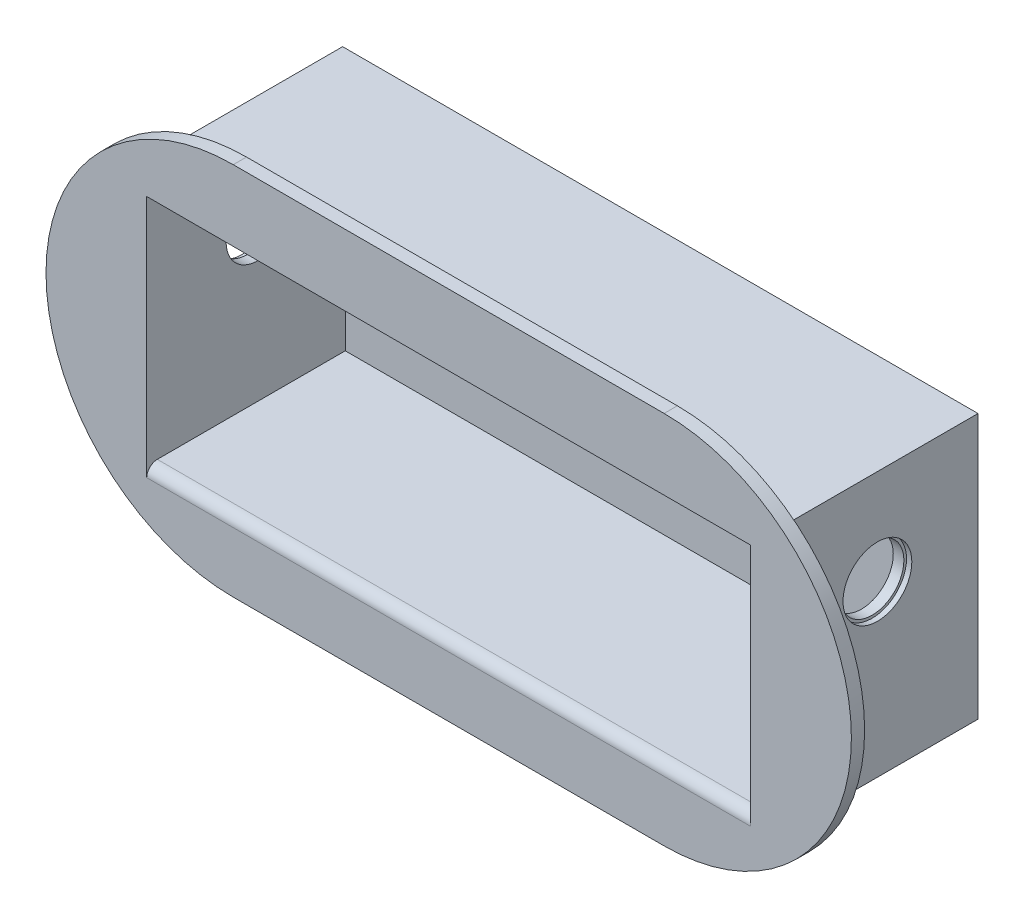
ISO-10303-21;
HEADER;
FILE_DESCRIPTION(('STEP AP214'),'2;1');
FILE_NAME('part.step','',(''),(''),'','','');
FILE_SCHEMA(('AUTOMOTIVE_DESIGN { 1 0 10303 214 1 1 1 1 }'));
ENDSEC;
DATA;
#1=APPLICATION_CONTEXT('core data for automotive mechanical design processes');
#2=APPLICATION_PROTOCOL_DEFINITION('international standard','automotive_design',2000,#1);
#3=PRODUCT_CONTEXT('',#1,'mechanical');
#4=PRODUCT('Part','Part','',(#3));
#5=PRODUCT_RELATED_PRODUCT_CATEGORY('part','',(#4));
#6=PRODUCT_DEFINITION_FORMATION('','',#4);
#7=PRODUCT_DEFINITION_CONTEXT('part definition',#1,'design');
#8=PRODUCT_DEFINITION('design','',#6,#7);
#9=PRODUCT_DEFINITION_SHAPE('','',#8);
#10=(LENGTH_UNIT() NAMED_UNIT(*) SI_UNIT(.MILLI.,.METRE.));
#11=(NAMED_UNIT(*) PLANE_ANGLE_UNIT() SI_UNIT($,.RADIAN.));
#12=(NAMED_UNIT(*) SI_UNIT($,.STERADIAN.) SOLID_ANGLE_UNIT());
#13=UNCERTAINTY_MEASURE_WITH_UNIT(LENGTH_MEASURE(1.E-05),#10,'distance_accuracy_value','');
#14=(GEOMETRIC_REPRESENTATION_CONTEXT(3) GLOBAL_UNCERTAINTY_ASSIGNED_CONTEXT((#13)) GLOBAL_UNIT_ASSIGNED_CONTEXT((#10,
#11,#12)) REPRESENTATION_CONTEXT('',''));
#15=CARTESIAN_POINT('',(0.,0.,0.));
#16=DIRECTION('',(0.,0.,1.));
#17=DIRECTION('',(1.,0.,0.));
#18=AXIS2_PLACEMENT_3D('',#15,#16,#17);
#19=CARTESIAN_POINT('',(193.262166617671,17.7800000000001,48.26));
#20=DIRECTION('',(-1.,0.,0.));
#21=DIRECTION('',(0.,-1.,0.));
#22=AXIS2_PLACEMENT_3D('',#19,#20,#21);
#23=CYLINDRICAL_SURFACE('',#22,15.24);
#24=CARTESIAN_POINT('',(-144.78,17.78,48.26));
#25=DIRECTION('',(1.,0.,0.));
#26=DIRECTION('',(0.,1.,0.));
#27=AXIS2_PLACEMENT_3D('',#24,#25,#26);
#28=CIRCLE('',#27,15.24);
#29=CARTESIAN_POINT('',(-144.78,33.02,48.26));
#30=VERTEX_POINT('',#29);
#31=EDGE_CURVE('E168',#30,#30,#28,.T.);
#32=ORIENTED_EDGE('',*,*,#31,.T.);
#33=EDGE_LOOP('',(#32));
#34=FACE_BOUND('',#33,.T.);
#35=CARTESIAN_POINT('',(-149.86,17.78,48.26));
#36=DIRECTION('',(-1.,0.,0.));
#37=DIRECTION('',(0.,0.,1.));
#38=AXIS2_PLACEMENT_3D('',#35,#36,#37);
#39=CIRCLE('',#38,15.24);
#40=CARTESIAN_POINT('',(-149.86,17.78,63.5));
#41=VERTEX_POINT('',#40);
#42=EDGE_CURVE('E43',#41,#41,#39,.F.);
#43=ORIENTED_EDGE('',*,*,#42,.F.);
#44=EDGE_LOOP('',(#43));
#45=FACE_BOUND('',#44,.T.);
#46=ADVANCED_FACE('F39',(#34,#45),#23,.F.);
#47=CARTESIAN_POINT('',(144.78,17.78,48.26));
#48=DIRECTION('',(-1.,0.,0.));
#49=DIRECTION('',(0.,-1.,0.));
#50=AXIS2_PLACEMENT_3D('',#47,#48,#49);
#51=CIRCLE('',#50,15.24);
#52=CARTESIAN_POINT('',(144.78,2.54000000000005,48.26));
#53=VERTEX_POINT('',#52);
#54=EDGE_CURVE('E247',#53,#53,#51,.T.);
#55=ORIENTED_EDGE('',*,*,#54,.T.);
#56=EDGE_LOOP('',(#55));
#57=FACE_BOUND('',#56,.T.);
#58=CARTESIAN_POINT('',(149.86,17.78,48.26));
#59=DIRECTION('',(1.,0.,0.));
#60=DIRECTION('',(0.,0.,-1.));
#61=AXIS2_PLACEMENT_3D('',#58,#59,#60);
#62=CIRCLE('',#61,15.24);
#63=CARTESIAN_POINT('',(149.86,17.78,33.02));
#64=VERTEX_POINT('',#63);
#65=EDGE_CURVE('E245',#64,#64,#62,.F.);
#66=ORIENTED_EDGE('',*,*,#65,.F.);
#67=EDGE_LOOP('',(#66));
#68=FACE_BOUND('',#67,.T.);
#69=ADVANCED_FACE('F273',(#57,#68),#23,.F.);
#70=CARTESIAN_POINT('',(0.,0.,101.6));
#71=DIRECTION('',(0.,0.,1.));
#72=DIRECTION('',(1.,0.,0.));
#73=AXIS2_PLACEMENT_3D('',#70,#71,#72);
#74=PLANE('',#73);
#75=DIRECTION('',(0.,1.,0.));
#76=VECTOR('',#75,1.);
#77=CARTESIAN_POINT('',(144.78,-55.88,101.6));
#78=LINE('',#77,#76);
#79=CARTESIAN_POINT('',(144.78,-60.96,101.6));
#80=VERTEX_POINT('',#79);
#81=CARTESIAN_POINT('',(144.78,55.88,101.6));
#82=VERTEX_POINT('',#81);
#83=EDGE_CURVE('E56',#80,#82,#78,.T.);
#84=ORIENTED_EDGE('',*,*,#83,.F.);
#85=DIRECTION('',(1.,0.,0.));
#86=VECTOR('',#85,1.);
#87=CARTESIAN_POINT('',(0.,-60.96,101.6));
#88=LINE('',#87,#86);
#89=CARTESIAN_POINT('',(-144.78,-60.96,101.6));
#90=VERTEX_POINT('',#89);
#91=EDGE_CURVE('E237',#80,#90,#88,.F.);
#92=ORIENTED_EDGE('',*,*,#91,.T.);
#93=DIRECTION('',(0.,-1.,0.));
#94=VECTOR('',#93,1.);
#95=CARTESIAN_POINT('',(-144.78,55.88,101.6));
#96=LINE('',#95,#94);
#97=CARTESIAN_POINT('',(-144.78,55.88,101.6));
#98=VERTEX_POINT('',#97);
#99=EDGE_CURVE('E63',#98,#90,#96,.T.);
#100=ORIENTED_EDGE('',*,*,#99,.F.);
#101=DIRECTION('',(-1.,0.,0.));
#102=VECTOR('',#101,1.);
#103=CARTESIAN_POINT('',(144.78,55.88,101.6));
#104=LINE('',#103,#102);
#105=EDGE_CURVE('E514',#82,#98,#104,.T.);
#106=ORIENTED_EDGE('',*,*,#105,.F.);
#107=EDGE_LOOP('',(#84,#92,#100,#106));
#108=FACE_BOUND('',#107,.T.);
#109=CARTESIAN_POINT('',(-103.259510136844,0.,101.6));
#110=DIRECTION('',(0.,0.,1.));
#111=DIRECTION('',(1.,0.,0.));
#112=AXIS2_PLACEMENT_3D('',#109,#110,#111);
#113=CIRCLE('',#112,89.8371201713388);
#114=CARTESIAN_POINT('',(-103.259510136844,89.8371201713388,101.6));
#115=VERTEX_POINT('',#114);
#116=CARTESIAN_POINT('',(-103.259510136844,-89.8371201713388,101.6));
#117=VERTEX_POINT('',#116);
#118=EDGE_CURVE('E173',#115,#117,#113,.T.);
#119=ORIENTED_EDGE('',*,*,#118,.T.);
#120=DIRECTION('',(1.,0.,0.));
#121=VECTOR('',#120,1.);
#122=CARTESIAN_POINT('',(-103.259510136844,-89.8371201713388,101.6));
#123=LINE('',#122,#121);
#124=CARTESIAN_POINT('',(103.425046446333,-89.8371201713388,101.6));
#125=VERTEX_POINT('',#124);
#126=EDGE_CURVE('E141',#117,#125,#123,.T.);
#127=ORIENTED_EDGE('',*,*,#126,.T.);
#128=CARTESIAN_POINT('',(103.425046446333,0.,101.6));
#129=DIRECTION('',(0.,0.,1.));
#130=DIRECTION('',(1.,0.,0.));
#131=AXIS2_PLACEMENT_3D('',#128,#129,#130);
#132=CIRCLE('',#131,89.8371201713388);
#133=CARTESIAN_POINT('',(103.425046446333,89.8371201713388,101.6));
#134=VERTEX_POINT('',#133);
#135=EDGE_CURVE('E165',#125,#134,#132,.T.);
#136=ORIENTED_EDGE('',*,*,#135,.T.);
#137=DIRECTION('',(-1.,0.,0.));
#138=VECTOR('',#137,1.);
#139=CARTESIAN_POINT('',(-103.259510136844,89.8371201713388,101.6));
#140=LINE('',#139,#138);
#141=EDGE_CURVE('E162',#134,#115,#140,.T.);
#142=ORIENTED_EDGE('',*,*,#141,.T.);
#143=EDGE_LOOP('',(#119,#127,#136,#142));
#144=FACE_BOUND('',#143,.T.);
#145=ADVANCED_FACE('F279',(#108,#144),#74,.T.);
#146=CARTESIAN_POINT('',(0.,0.,6.35000000000031));
#147=DIRECTION('',(0.,0.,1.));
#148=DIRECTION('',(1.,0.,0.));
#149=AXIS2_PLACEMENT_3D('',#146,#147,#148);
#150=PLANE('',#149);
#151=DIRECTION('',(1.,0.,0.));
#152=VECTOR('',#151,1.);
#153=CARTESIAN_POINT('',(-144.78,-55.88,6.34999999999999));
#154=LINE('',#153,#152);
#155=CARTESIAN_POINT('',(-144.78,-55.88,6.34999999999999));
#156=VERTEX_POINT('',#155);
#157=CARTESIAN_POINT('',(144.78,-55.88,6.34999999999999));
#158=VERTEX_POINT('',#157);
#159=EDGE_CURVE('E194',#156,#158,#154,.T.);
#160=ORIENTED_EDGE('',*,*,#159,.T.);
#161=DIRECTION('',(0.,1.,0.));
#162=VECTOR('',#161,1.);
#163=CARTESIAN_POINT('',(144.78,-55.88,6.34999999999999));
#164=LINE('',#163,#162);
#165=CARTESIAN_POINT('',(144.78,55.88,6.34999999999999));
#166=VERTEX_POINT('',#165);
#167=EDGE_CURVE('E512',#158,#166,#164,.T.);
#168=ORIENTED_EDGE('',*,*,#167,.T.);
#169=DIRECTION('',(-1.,0.,0.));
#170=VECTOR('',#169,1.);
#171=CARTESIAN_POINT('',(144.78,55.88,6.34999999999999));
#172=LINE('',#171,#170);
#173=CARTESIAN_POINT('',(-144.78,55.88,6.34999999999999));
#174=VERTEX_POINT('',#173);
#175=EDGE_CURVE('E517',#166,#174,#172,.T.);
#176=ORIENTED_EDGE('',*,*,#175,.T.);
#177=DIRECTION('',(0.,-1.,0.));
#178=VECTOR('',#177,1.);
#179=CARTESIAN_POINT('',(-144.78,55.88,6.34999999999999));
#180=LINE('',#179,#178);
#181=EDGE_CURVE('E202',#174,#156,#180,.T.);
#182=ORIENTED_EDGE('',*,*,#181,.T.);
#183=EDGE_LOOP('',(#160,#168,#176,#182));
#184=FACE_BOUND('',#183,.T.);
#185=ADVANCED_FACE('F289',(#184),#150,.T.);
#186=CARTESIAN_POINT('',(-144.78,-55.88,101.6));
#187=DIRECTION('',(0.,1.,0.));
#188=DIRECTION('',(0.,0.,1.));
#189=AXIS2_PLACEMENT_3D('',#186,#187,#188);
#190=PLANE('',#189);
#191=DIRECTION('',(0.,0.,-1.));
#192=VECTOR('',#191,1.);
#193=CARTESIAN_POINT('',(-144.78,-55.88,101.6));
#194=LINE('',#193,#192);
#195=CARTESIAN_POINT('',(-144.78,-55.88,96.52));
#196=VERTEX_POINT('',#195);
#197=EDGE_CURVE('E203',#196,#156,#194,.T.);
#198=ORIENTED_EDGE('',*,*,#197,.F.);
#199=DIRECTION('',(1.,0.,0.));
#200=VECTOR('',#199,1.);
#201=CARTESIAN_POINT('',(-144.78,-55.88,96.52));
#202=LINE('',#201,#200);
#203=CARTESIAN_POINT('',(144.78,-55.88,96.52));
#204=VERTEX_POINT('',#203);
#205=EDGE_CURVE('E208',#196,#204,#202,.T.);
#206=ORIENTED_EDGE('',*,*,#205,.T.);
#207=DIRECTION('',(0.,0.,-1.));
#208=VECTOR('',#207,1.);
#209=CARTESIAN_POINT('',(144.78,-55.88,101.6));
#210=LINE('',#209,#208);
#211=EDGE_CURVE('E199',#204,#158,#210,.T.);
#212=ORIENTED_EDGE('',*,*,#211,.T.);
#213=ORIENTED_EDGE('',*,*,#159,.F.);
#214=EDGE_LOOP('',(#198,#206,#212,#213));
#215=FACE_BOUND('',#214,.T.);
#216=ADVANCED_FACE('F303',(#215),#190,.T.);
#217=CARTESIAN_POINT('',(-144.78,55.88,101.6));
#218=DIRECTION('',(1.,0.,0.));
#219=DIRECTION('',(0.,1.,0.));
#220=AXIS2_PLACEMENT_3D('',#217,#218,#219);
#221=PLANE('',#220);
#222=ORIENTED_EDGE('',*,*,#31,.F.);
#223=EDGE_LOOP('',(#222));
#224=FACE_BOUND('',#223,.T.);
#225=ORIENTED_EDGE('',*,*,#99,.T.);
#226=CARTESIAN_POINT('',(-144.78,-60.96,96.52));
#227=DIRECTION('',(1.,0.,0.));
#228=DIRECTION('',(0.,1.,0.));
#229=AXIS2_PLACEMENT_3D('',#226,#227,#228);
#230=CIRCLE('',#229,5.08);
#231=EDGE_CURVE('E12',#90,#196,#230,.F.);
#232=ORIENTED_EDGE('',*,*,#231,.T.);
#233=ORIENTED_EDGE('',*,*,#197,.T.);
#234=ORIENTED_EDGE('',*,*,#181,.F.);
#235=DIRECTION('',(0.,0.,-1.));
#236=VECTOR('',#235,1.);
#237=CARTESIAN_POINT('',(-144.78,55.88,101.6));
#238=LINE('',#237,#236);
#239=EDGE_CURVE('E523',#98,#174,#238,.T.);
#240=ORIENTED_EDGE('',*,*,#239,.F.);
#241=EDGE_LOOP('',(#225,#232,#233,#234,#240));
#242=FACE_BOUND('',#241,.T.);
#243=ADVANCED_FACE('F306',(#224,#242),#221,.T.);
#244=CARTESIAN_POINT('',(144.78,55.88,101.6));
#245=DIRECTION('',(0.,-1.,0.));
#246=DIRECTION('',(0.,0.,-1.));
#247=AXIS2_PLACEMENT_3D('',#244,#245,#246);
#248=PLANE('',#247);
#249=ORIENTED_EDGE('',*,*,#239,.T.);
#250=ORIENTED_EDGE('',*,*,#175,.F.);
#251=DIRECTION('',(0.,0.,-1.));
#252=VECTOR('',#251,1.);
#253=CARTESIAN_POINT('',(144.78,55.88,101.6));
#254=LINE('',#253,#252);
#255=EDGE_CURVE('E520',#82,#166,#254,.T.);
#256=ORIENTED_EDGE('',*,*,#255,.F.);
#257=ORIENTED_EDGE('',*,*,#105,.T.);
#258=EDGE_LOOP('',(#249,#250,#256,#257));
#259=FACE_BOUND('',#258,.T.);
#260=ADVANCED_FACE('F309',(#259),#248,.T.);
#261=CARTESIAN_POINT('',(144.78,-55.88,101.6));
#262=DIRECTION('',(-1.,0.,0.));
#263=DIRECTION('',(0.,-1.,0.));
#264=AXIS2_PLACEMENT_3D('',#261,#262,#263);
#265=PLANE('',#264);
#266=ORIENTED_EDGE('',*,*,#54,.F.);
#267=EDGE_LOOP('',(#266));
#268=FACE_BOUND('',#267,.T.);
#269=ORIENTED_EDGE('',*,*,#255,.T.);
#270=ORIENTED_EDGE('',*,*,#167,.F.);
#271=ORIENTED_EDGE('',*,*,#211,.F.);
#272=CARTESIAN_POINT('',(144.78,-60.96,96.52));
#273=DIRECTION('',(-1.,0.,0.));
#274=DIRECTION('',(0.,-1.,0.));
#275=AXIS2_PLACEMENT_3D('',#272,#273,#274);
#276=CIRCLE('',#275,5.08);
#277=EDGE_CURVE('E48',#204,#80,#276,.F.);
#278=ORIENTED_EDGE('',*,*,#277,.T.);
#279=ORIENTED_EDGE('',*,*,#83,.T.);
#280=EDGE_LOOP('',(#269,#270,#271,#278,#279));
#281=FACE_BOUND('',#280,.T.);
#282=ADVANCED_FACE('F288',(#268,#281),#265,.T.);
#283=CARTESIAN_POINT('',(-103.259510136844,0.,95.25));
#284=DIRECTION('',(0.,0.,1.));
#285=DIRECTION('',(1.,0.,0.));
#286=AXIS2_PLACEMENT_3D('',#283,#284,#285);
#287=PLANE('',#286);
#288=CARTESIAN_POINT('',(-103.259510136844,0.,95.25));
#289=DIRECTION('',(0.,0.,1.));
#290=DIRECTION('',(1.,0.,0.));
#291=AXIS2_PLACEMENT_3D('',#288,#289,#290);
#292=CIRCLE('',#291,89.8371201713388);
#293=CARTESIAN_POINT('',(-103.259510136844,89.8371201713388,95.25));
#294=VERTEX_POINT('',#293);
#295=CARTESIAN_POINT('',(-103.259510136844,-89.8371201713388,95.25));
#296=VERTEX_POINT('',#295);
#297=EDGE_CURVE('E155',#294,#296,#292,.T.);
#298=ORIENTED_EDGE('',*,*,#297,.F.);
#299=DIRECTION('',(-1.,0.,0.));
#300=VECTOR('',#299,1.);
#301=CARTESIAN_POINT('',(-103.259510136844,89.8371201713388,95.25));
#302=LINE('',#301,#300);
#303=CARTESIAN_POINT('',(103.425046446333,89.8371201713388,95.25));
#304=VERTEX_POINT('',#303);
#305=EDGE_CURVE('E147',#304,#294,#302,.T.);
#306=ORIENTED_EDGE('',*,*,#305,.F.);
#307=CARTESIAN_POINT('',(103.425046446333,0.,95.25));
#308=DIRECTION('',(0.,0.,1.));
#309=DIRECTION('',(1.,0.,0.));
#310=AXIS2_PLACEMENT_3D('',#307,#308,#309);
#311=CIRCLE('',#310,89.8371201713388);
#312=CARTESIAN_POINT('',(103.425046446333,-89.8371201713388,95.25));
#313=VERTEX_POINT('',#312);
#314=EDGE_CURVE('E158',#313,#304,#311,.T.);
#315=ORIENTED_EDGE('',*,*,#314,.F.);
#316=DIRECTION('',(1.,0.,0.));
#317=VECTOR('',#316,1.);
#318=CARTESIAN_POINT('',(-103.259510136844,-89.8371201713388,95.25));
#319=LINE('',#318,#317);
#320=EDGE_CURVE('E139',#296,#313,#319,.T.);
#321=ORIENTED_EDGE('',*,*,#320,.F.);
#322=EDGE_LOOP('',(#298,#306,#315,#321));
#323=FACE_BOUND('',#322,.T.);
#324=DIRECTION('',(1.,0.,0.));
#325=VECTOR('',#324,1.);
#326=CARTESIAN_POINT('',(-152.4,-63.5,95.25));
#327=LINE('',#326,#325);
#328=CARTESIAN_POINT('',(-152.4,-63.5,95.25));
#329=VERTEX_POINT('',#328);
#330=CARTESIAN_POINT('',(152.4,-63.5,95.25));
#331=VERTEX_POINT('',#330);
#332=EDGE_CURVE('E179',#329,#331,#327,.T.);
#333=ORIENTED_EDGE('',*,*,#332,.T.);
#334=DIRECTION('',(0.,1.,0.));
#335=VECTOR('',#334,1.);
#336=CARTESIAN_POINT('',(152.4,63.5,95.25));
#337=LINE('',#336,#335);
#338=CARTESIAN_POINT('',(152.4,63.5,95.25));
#339=VERTEX_POINT('',#338);
#340=EDGE_CURVE('E191',#331,#339,#337,.T.);
#341=ORIENTED_EDGE('',*,*,#340,.T.);
#342=DIRECTION('',(-1.,0.,0.));
#343=VECTOR('',#342,1.);
#344=CARTESIAN_POINT('',(-152.4,63.5,95.25));
#345=LINE('',#344,#343);
#346=CARTESIAN_POINT('',(-152.4,63.5,95.25));
#347=VERTEX_POINT('',#346);
#348=EDGE_CURVE('E188',#339,#347,#345,.T.);
#349=ORIENTED_EDGE('',*,*,#348,.T.);
#350=DIRECTION('',(0.,-1.,0.));
#351=VECTOR('',#350,1.);
#352=CARTESIAN_POINT('',(-152.4,63.5,95.25));
#353=LINE('',#352,#351);
#354=EDGE_CURVE('E185',#347,#329,#353,.T.);
#355=ORIENTED_EDGE('',*,*,#354,.T.);
#356=EDGE_LOOP('',(#333,#341,#349,#355));
#357=FACE_BOUND('',#356,.T.);
#358=ADVANCED_FACE('F152',(#323,#357),#287,.F.);
#359=CARTESIAN_POINT('',(-103.259510136844,0.,95.25));
#360=DIRECTION('',(0.,0.,1.));
#361=DIRECTION('',(1.,0.,0.));
#362=AXIS2_PLACEMENT_3D('',#359,#360,#361);
#363=CYLINDRICAL_SURFACE('',#362,89.8371201713388);
#364=ORIENTED_EDGE('',*,*,#118,.F.);
#365=DIRECTION('',(0.,0.,1.));
#366=VECTOR('',#365,1.);
#367=CARTESIAN_POINT('',(-103.259510136844,89.8371201713388,95.25));
#368=LINE('',#367,#366);
#369=EDGE_CURVE('E161',#294,#115,#368,.T.);
#370=ORIENTED_EDGE('',*,*,#369,.F.);
#371=ORIENTED_EDGE('',*,*,#297,.T.);
#372=DIRECTION('',(0.,0.,1.));
#373=VECTOR('',#372,1.);
#374=CARTESIAN_POINT('',(-103.259510136844,-89.8371201713388,95.25));
#375=LINE('',#374,#373);
#376=EDGE_CURVE('E136',#296,#117,#375,.T.);
#377=ORIENTED_EDGE('',*,*,#376,.T.);
#378=EDGE_LOOP('',(#364,#370,#371,#377));
#379=FACE_BOUND('',#378,.T.);
#380=ADVANCED_FACE('F160',(#379),#363,.T.);
#381=CARTESIAN_POINT('',(-103.259510136844,89.8371201713388,95.25));
#382=DIRECTION('',(0.,1.,0.));
#383=DIRECTION('',(0.,0.,1.));
#384=AXIS2_PLACEMENT_3D('',#381,#382,#383);
#385=PLANE('',#384);
#386=ORIENTED_EDGE('',*,*,#141,.F.);
#387=DIRECTION('',(0.,0.,1.));
#388=VECTOR('',#387,1.);
#389=CARTESIAN_POINT('',(103.425046446333,89.8371201713388,95.25));
#390=LINE('',#389,#388);
#391=EDGE_CURVE('E180',#304,#134,#390,.T.);
#392=ORIENTED_EDGE('',*,*,#391,.F.);
#393=ORIENTED_EDGE('',*,*,#305,.T.);
#394=ORIENTED_EDGE('',*,*,#369,.T.);
#395=EDGE_LOOP('',(#386,#392,#393,#394));
#396=FACE_BOUND('',#395,.T.);
#397=ADVANCED_FACE('F290',(#396),#385,.T.);
#398=CARTESIAN_POINT('',(103.425046446333,0.,95.25));
#399=DIRECTION('',(0.,0.,1.));
#400=DIRECTION('',(1.,0.,0.));
#401=AXIS2_PLACEMENT_3D('',#398,#399,#400);
#402=CYLINDRICAL_SURFACE('',#401,89.8371201713388);
#403=ORIENTED_EDGE('',*,*,#135,.F.);
#404=DIRECTION('',(0.,0.,1.));
#405=VECTOR('',#404,1.);
#406=CARTESIAN_POINT('',(103.425046446333,-89.8371201713388,95.25));
#407=LINE('',#406,#405);
#408=EDGE_CURVE('E146',#313,#125,#407,.T.);
#409=ORIENTED_EDGE('',*,*,#408,.F.);
#410=ORIENTED_EDGE('',*,*,#314,.T.);
#411=ORIENTED_EDGE('',*,*,#391,.T.);
#412=EDGE_LOOP('',(#403,#409,#410,#411));
#413=FACE_BOUND('',#412,.T.);
#414=ADVANCED_FACE('F293',(#413),#402,.T.);
#415=CARTESIAN_POINT('',(-103.259510136844,-89.8371201713388,95.25));
#416=DIRECTION('',(0.,-1.,0.));
#417=DIRECTION('',(0.,0.,-1.));
#418=AXIS2_PLACEMENT_3D('',#415,#416,#417);
#419=PLANE('',#418);
#420=ORIENTED_EDGE('',*,*,#126,.F.);
#421=ORIENTED_EDGE('',*,*,#376,.F.);
#422=ORIENTED_EDGE('',*,*,#320,.T.);
#423=ORIENTED_EDGE('',*,*,#408,.T.);
#424=EDGE_LOOP('',(#420,#421,#422,#423));
#425=FACE_BOUND('',#424,.T.);
#426=ADVANCED_FACE('F138',(#425),#419,.T.);
#427=CARTESIAN_POINT('',(0.,0.,0.));
#428=DIRECTION('',(0.,0.,1.));
#429=DIRECTION('',(1.,0.,0.));
#430=AXIS2_PLACEMENT_3D('',#427,#428,#429);
#431=PLANE('',#430);
#432=DIRECTION('',(0.,1.,0.));
#433=VECTOR('',#432,1.);
#434=CARTESIAN_POINT('',(152.4,63.5,0.));
#435=LINE('',#434,#433);
#436=CARTESIAN_POINT('',(152.4,-63.5,0.));
#437=VERTEX_POINT('',#436);
#438=CARTESIAN_POINT('',(152.4,63.5,0.));
#439=VERTEX_POINT('',#438);
#440=EDGE_CURVE('E215',#437,#439,#435,.T.);
#441=ORIENTED_EDGE('',*,*,#440,.F.);
#442=DIRECTION('',(1.,0.,0.));
#443=VECTOR('',#442,1.);
#444=CARTESIAN_POINT('',(-152.4,-63.5,0.));
#445=LINE('',#444,#443);
#446=CARTESIAN_POINT('',(-152.4,-63.5,0.));
#447=VERTEX_POINT('',#446);
#448=EDGE_CURVE('E224',#447,#437,#445,.T.);
#449=ORIENTED_EDGE('',*,*,#448,.F.);
#450=DIRECTION('',(0.,-1.,0.));
#451=VECTOR('',#450,1.);
#452=CARTESIAN_POINT('',(-152.4,63.5,0.));
#453=LINE('',#452,#451);
#454=CARTESIAN_POINT('',(-152.4,63.5,0.));
#455=VERTEX_POINT('',#454);
#456=EDGE_CURVE('E221',#455,#447,#453,.T.);
#457=ORIENTED_EDGE('',*,*,#456,.F.);
#458=DIRECTION('',(-1.,0.,0.));
#459=VECTOR('',#458,1.);
#460=CARTESIAN_POINT('',(-152.4,63.5,0.));
#461=LINE('',#460,#459);
#462=EDGE_CURVE('E218',#439,#455,#461,.T.);
#463=ORIENTED_EDGE('',*,*,#462,.F.);
#464=EDGE_LOOP('',(#441,#449,#457,#463));
#465=FACE_BOUND('',#464,.T.);
#466=ADVANCED_FACE('F300',(#465),#431,.F.);
#467=CARTESIAN_POINT('',(-152.4,-63.5,101.6));
#468=DIRECTION('',(0.,1.,0.));
#469=DIRECTION('',(0.,0.,1.));
#470=AXIS2_PLACEMENT_3D('',#467,#468,#469);
#471=PLANE('',#470);
#472=ORIENTED_EDGE('',*,*,#332,.F.);
#473=DIRECTION('',(0.,0.,-1.));
#474=VECTOR('',#473,1.);
#475=CARTESIAN_POINT('',(-152.4,-63.5,101.6));
#476=LINE('',#475,#474);
#477=EDGE_CURVE('E229',#329,#447,#476,.T.);
#478=ORIENTED_EDGE('',*,*,#477,.T.);
#479=ORIENTED_EDGE('',*,*,#448,.T.);
#480=DIRECTION('',(0.,0.,-1.));
#481=VECTOR('',#480,1.);
#482=CARTESIAN_POINT('',(152.4,-63.5,101.6));
#483=LINE('',#482,#481);
#484=EDGE_CURVE('E227',#331,#437,#483,.T.);
#485=ORIENTED_EDGE('',*,*,#484,.F.);
#486=EDGE_LOOP('',(#472,#478,#479,#485));
#487=FACE_BOUND('',#486,.T.);
#488=ADVANCED_FACE('F324',(#487),#471,.F.);
#489=CARTESIAN_POINT('',(-152.4,63.5,101.6));
#490=DIRECTION('',(1.,0.,0.));
#491=DIRECTION('',(0.,1.,0.));
#492=AXIS2_PLACEMENT_3D('',#489,#490,#491);
#493=PLANE('',#492);
#494=CARTESIAN_POINT('',(-152.4,17.78,48.26));
#495=DIRECTION('',(1.,0.,0.));
#496=DIRECTION('',(0.,0.,-1.));
#497=AXIS2_PLACEMENT_3D('',#494,#495,#496);
#498=CIRCLE('',#497,16.51);
#499=CARTESIAN_POINT('',(-152.4,17.78,31.75));
#500=VERTEX_POINT('',#499);
#501=EDGE_CURVE('E260',#500,#500,#498,.T.);
#502=ORIENTED_EDGE('',*,*,#501,.T.);
#503=EDGE_LOOP('',(#502));
#504=FACE_BOUND('',#503,.T.);
#505=ORIENTED_EDGE('',*,*,#354,.F.);
#506=DIRECTION('',(0.,0.,-1.));
#507=VECTOR('',#506,1.);
#508=CARTESIAN_POINT('',(-152.4,63.5,101.6));
#509=LINE('',#508,#507);
#510=EDGE_CURVE('E230',#347,#455,#509,.T.);
#511=ORIENTED_EDGE('',*,*,#510,.T.);
#512=ORIENTED_EDGE('',*,*,#456,.T.);
#513=ORIENTED_EDGE('',*,*,#477,.F.);
#514=EDGE_LOOP('',(#505,#511,#512,#513));
#515=FACE_BOUND('',#514,.T.);
#516=ADVANCED_FACE('F328',(#504,#515),#493,.F.);
#517=CARTESIAN_POINT('',(-152.4,63.5,101.6));
#518=DIRECTION('',(0.,-1.,0.));
#519=DIRECTION('',(0.,0.,-1.));
#520=AXIS2_PLACEMENT_3D('',#517,#518,#519);
#521=PLANE('',#520);
#522=ORIENTED_EDGE('',*,*,#348,.F.);
#523=DIRECTION('',(0.,0.,-1.));
#524=VECTOR('',#523,1.);
#525=CARTESIAN_POINT('',(152.4,63.5,101.6));
#526=LINE('',#525,#524);
#527=EDGE_CURVE('E204',#339,#439,#526,.T.);
#528=ORIENTED_EDGE('',*,*,#527,.T.);
#529=ORIENTED_EDGE('',*,*,#462,.T.);
#530=ORIENTED_EDGE('',*,*,#510,.F.);
#531=EDGE_LOOP('',(#522,#528,#529,#530));
#532=FACE_BOUND('',#531,.T.);
#533=ADVANCED_FACE('F332',(#532),#521,.F.);
#534=CARTESIAN_POINT('',(152.4,63.5,101.6));
#535=DIRECTION('',(-1.,0.,0.));
#536=DIRECTION('',(0.,-1.,0.));
#537=AXIS2_PLACEMENT_3D('',#534,#535,#536);
#538=PLANE('',#537);
#539=CARTESIAN_POINT('',(152.4,17.78,48.26));
#540=DIRECTION('',(1.,0.,0.));
#541=DIRECTION('',(0.,0.,-1.));
#542=AXIS2_PLACEMENT_3D('',#539,#540,#541);
#543=CIRCLE('',#542,16.51);
#544=CARTESIAN_POINT('',(152.4,17.78,31.75));
#545=VERTEX_POINT('',#544);
#546=EDGE_CURVE('E253',#545,#545,#543,.T.);
#547=ORIENTED_EDGE('',*,*,#546,.F.);
#548=EDGE_LOOP('',(#547));
#549=FACE_BOUND('',#548,.T.);
#550=ORIENTED_EDGE('',*,*,#340,.F.);
#551=ORIENTED_EDGE('',*,*,#484,.T.);
#552=ORIENTED_EDGE('',*,*,#440,.T.);
#553=ORIENTED_EDGE('',*,*,#527,.F.);
#554=EDGE_LOOP('',(#550,#551,#552,#553));
#555=FACE_BOUND('',#554,.T.);
#556=ADVANCED_FACE('F335',(#549,#555),#538,.F.);
#557=CARTESIAN_POINT('',(-144.78,-60.96,96.52));
#558=DIRECTION('',(1.,0.,0.));
#559=DIRECTION('',(0.,0.,-1.));
#560=AXIS2_PLACEMENT_3D('',#557,#558,#559);
#561=CYLINDRICAL_SURFACE('',#560,5.08);
#562=ORIENTED_EDGE('',*,*,#231,.F.);
#563=ORIENTED_EDGE('',*,*,#91,.F.);
#564=ORIENTED_EDGE('',*,*,#277,.F.);
#565=ORIENTED_EDGE('',*,*,#205,.F.);
#566=EDGE_LOOP('',(#562,#563,#564,#565));
#567=FACE_BOUND('',#566,.T.);
#568=ADVANCED_FACE('F41',(#567),#561,.T.);
#569=CARTESIAN_POINT('',(149.86,17.78,48.26));
#570=DIRECTION('',(1.,0.,0.));
#571=DIRECTION('',(0.,0.,-1.));
#572=AXIS2_PLACEMENT_3D('',#569,#570,#571);
#573=PLANE('',#572);
#574=CARTESIAN_POINT('',(149.86,17.78,48.26));
#575=DIRECTION('',(1.,0.,0.));
#576=DIRECTION('',(0.,0.,-1.));
#577=AXIS2_PLACEMENT_3D('',#574,#575,#576);
#578=CIRCLE('',#577,16.51);
#579=CARTESIAN_POINT('',(149.86,17.78,31.75));
#580=VERTEX_POINT('',#579);
#581=EDGE_CURVE('E248',#580,#580,#578,.T.);
#582=ORIENTED_EDGE('',*,*,#581,.T.);
#583=EDGE_LOOP('',(#582));
#584=FACE_BOUND('',#583,.T.);
#585=ORIENTED_EDGE('',*,*,#65,.T.);
#586=EDGE_LOOP('',(#585));
#587=FACE_BOUND('',#586,.T.);
#588=ADVANCED_FACE('F341',(#584,#587),#573,.T.);
#589=CARTESIAN_POINT('',(149.86,17.78,48.26));
#590=DIRECTION('',(1.,0.,0.));
#591=DIRECTION('',(0.,0.,-1.));
#592=AXIS2_PLACEMENT_3D('',#589,#590,#591);
#593=CYLINDRICAL_SURFACE('',#592,16.51);
#594=ORIENTED_EDGE('',*,*,#581,.F.);
#595=EDGE_LOOP('',(#594));
#596=FACE_BOUND('',#595,.T.);
#597=ORIENTED_EDGE('',*,*,#546,.T.);
#598=EDGE_LOOP('',(#597));
#599=FACE_BOUND('',#598,.T.);
#600=ADVANCED_FACE('F284',(#596,#599),#593,.F.);
#601=CARTESIAN_POINT('',(-149.86,17.78,48.26));
#602=DIRECTION('',(-1.,0.,0.));
#603=DIRECTION('',(0.,0.,-1.));
#604=AXIS2_PLACEMENT_3D('',#601,#602,#603);
#605=PLANE('',#604);
#606=CARTESIAN_POINT('',(-149.86,17.78,48.26));
#607=DIRECTION('',(1.,0.,0.));
#608=DIRECTION('',(0.,0.,-1.));
#609=AXIS2_PLACEMENT_3D('',#606,#607,#608);
#610=CIRCLE('',#609,16.51);
#611=CARTESIAN_POINT('',(-149.86,17.78,31.75));
#612=VERTEX_POINT('',#611);
#613=EDGE_CURVE('E263',#612,#612,#610,.T.);
#614=ORIENTED_EDGE('',*,*,#613,.F.);
#615=EDGE_LOOP('',(#614));
#616=FACE_BOUND('',#615,.T.);
#617=ORIENTED_EDGE('',*,*,#42,.T.);
#618=EDGE_LOOP('',(#617));
#619=FACE_BOUND('',#618,.T.);
#620=ADVANCED_FACE('F270',(#616,#619),#605,.T.);
#621=CARTESIAN_POINT('',(-149.86,17.78,48.26));
#622=DIRECTION('',(-1.,0.,0.));
#623=DIRECTION('',(0.,0.,1.));
#624=AXIS2_PLACEMENT_3D('',#621,#622,#623);
#625=CYLINDRICAL_SURFACE('',#624,16.51);
#626=ORIENTED_EDGE('',*,*,#613,.T.);
#627=EDGE_LOOP('',(#626));
#628=FACE_BOUND('',#627,.T.);
#629=ORIENTED_EDGE('',*,*,#501,.F.);
#630=EDGE_LOOP('',(#629));
#631=FACE_BOUND('',#630,.T.);
#632=ADVANCED_FACE('F357',(#628,#631),#625,.F.);
#633=CLOSED_SHELL('',(#46,#69,#145,#185,#216,#243,#260,#282,#358,#380,#397,#414,#426,#466,#488,
#516,#533,#556,#568,#588,#600,#620,#632));
#634=MANIFOLD_SOLID_BREP('B2',#633);
#635=ADVANCED_BREP_SHAPE_REPRESENTATION('',(#18,#634),#14);
#636=SHAPE_DEFINITION_REPRESENTATION(#9,#635);
ENDSEC;
END-ISO-10303-21;
